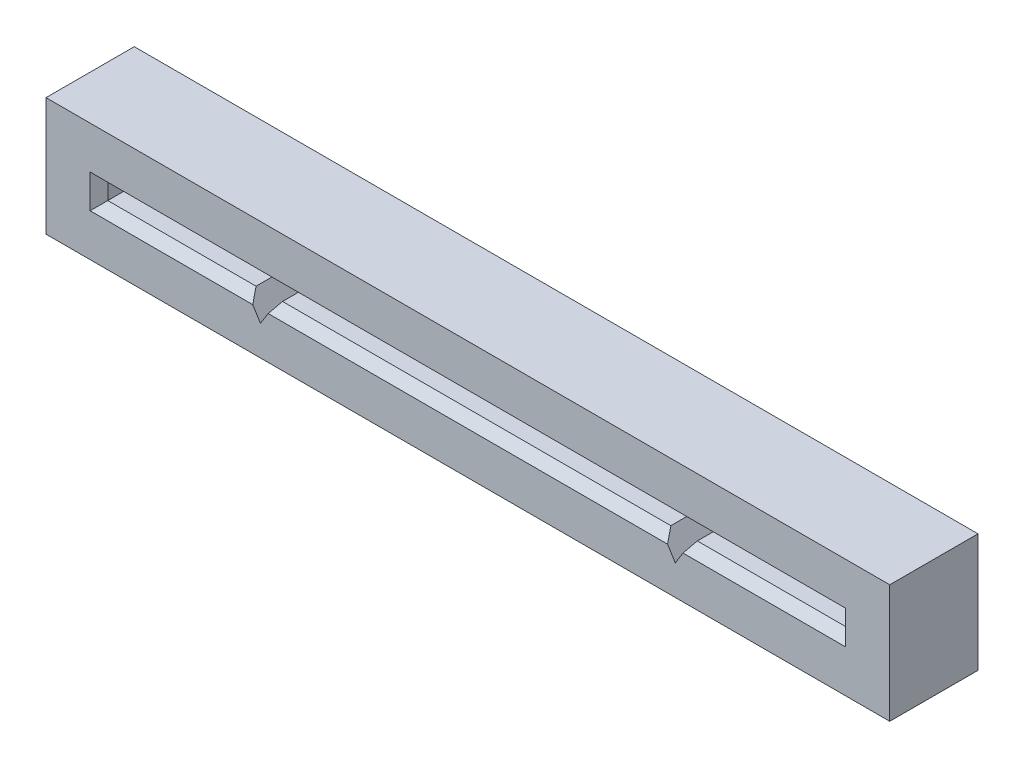
ISO-10303-21;
HEADER;
FILE_DESCRIPTION(('STEP AP214'),'2;1');
FILE_NAME('part.step','',(''),(''),'','','');
FILE_SCHEMA(('AUTOMOTIVE_DESIGN { 1 0 10303 214 1 1 1 1 }'));
ENDSEC;
DATA;
#1=APPLICATION_CONTEXT('core data for automotive mechanical design processes');
#2=APPLICATION_PROTOCOL_DEFINITION('international standard','automotive_design',2000,#1);
#3=PRODUCT_CONTEXT('',#1,'mechanical');
#4=PRODUCT('Part','Part','',(#3));
#5=PRODUCT_RELATED_PRODUCT_CATEGORY('part','',(#4));
#6=PRODUCT_DEFINITION_FORMATION('','',#4);
#7=PRODUCT_DEFINITION_CONTEXT('part definition',#1,'design');
#8=PRODUCT_DEFINITION('design','',#6,#7);
#9=PRODUCT_DEFINITION_SHAPE('','',#8);
#10=(LENGTH_UNIT() NAMED_UNIT(*) SI_UNIT(.MILLI.,.METRE.));
#11=(NAMED_UNIT(*) PLANE_ANGLE_UNIT() SI_UNIT($,.RADIAN.));
#12=(NAMED_UNIT(*) SI_UNIT($,.STERADIAN.) SOLID_ANGLE_UNIT());
#13=UNCERTAINTY_MEASURE_WITH_UNIT(LENGTH_MEASURE(1.E-05),#10,'distance_accuracy_value','');
#14=(GEOMETRIC_REPRESENTATION_CONTEXT(3) GLOBAL_UNCERTAINTY_ASSIGNED_CONTEXT((#13)) GLOBAL_UNIT_ASSIGNED_CONTEXT((#10,
#11,#12)) REPRESENTATION_CONTEXT('',''));
#15=CARTESIAN_POINT('',(0.,0.,0.));
#16=DIRECTION('',(0.,0.,1.));
#17=DIRECTION('',(1.,0.,0.));
#18=AXIS2_PLACEMENT_3D('',#15,#16,#17);
#19=CARTESIAN_POINT('',(-23.9,3.34999999999999,5.));
#20=DIRECTION('',(1.,0.,0.));
#21=DIRECTION('',(0.,0.,-1.));
#22=AXIS2_PLACEMENT_3D('',#19,#20,#21);
#23=PLANE('',#22);
#24=DIRECTION('',(0.,-1.,0.));
#25=VECTOR('',#24,1.);
#26=CARTESIAN_POINT('',(-23.9,3.34999999999999,0.));
#27=LINE('',#26,#25);
#28=CARTESIAN_POINT('',(-23.9,3.34999999999999,0.));
#29=VERTEX_POINT('',#28);
#30=CARTESIAN_POINT('',(-23.9,-3.35000000000001,0.));
#31=VERTEX_POINT('',#30);
#32=EDGE_CURVE('E196',#29,#31,#27,.T.);
#33=ORIENTED_EDGE('',*,*,#32,.T.);
#34=DIRECTION('',(0.,0.,-1.));
#35=VECTOR('',#34,1.);
#36=CARTESIAN_POINT('',(-23.9,-3.35000000000001,5.));
#37=LINE('',#36,#35);
#38=CARTESIAN_POINT('',(-23.9,-3.35000000000001,5.));
#39=VERTEX_POINT('',#38);
#40=EDGE_CURVE('E239',#39,#31,#37,.T.);
#41=ORIENTED_EDGE('',*,*,#40,.F.);
#42=DIRECTION('',(0.,-1.,0.));
#43=VECTOR('',#42,1.);
#44=CARTESIAN_POINT('',(-23.9,3.34999999999999,5.));
#45=LINE('',#44,#43);
#46=CARTESIAN_POINT('',(-23.9,3.34999999999999,5.));
#47=VERTEX_POINT('',#46);
#48=EDGE_CURVE('E213',#47,#39,#45,.T.);
#49=ORIENTED_EDGE('',*,*,#48,.F.);
#50=DIRECTION('',(0.,0.,-1.));
#51=VECTOR('',#50,1.);
#52=CARTESIAN_POINT('',(-23.9,3.34999999999999,5.));
#53=LINE('',#52,#51);
#54=EDGE_CURVE('E223',#47,#29,#53,.T.);
#55=ORIENTED_EDGE('',*,*,#54,.T.);
#56=EDGE_LOOP('',(#33,#41,#49,#55));
#57=FACE_BOUND('',#56,.T.);
#58=ADVANCED_FACE('F35',(#57),#23,.F.);
#59=CARTESIAN_POINT('',(23.9,-3.35000000000001,5.));
#60=DIRECTION('',(0.,1.,0.));
#61=DIRECTION('',(0.,0.,1.));
#62=AXIS2_PLACEMENT_3D('',#59,#60,#61);
#63=PLANE('',#62);
#64=DIRECTION('',(1.,0.,0.));
#65=VECTOR('',#64,1.);
#66=CARTESIAN_POINT('',(23.9,-3.35000000000001,0.));
#67=LINE('',#66,#65);
#68=CARTESIAN_POINT('',(23.9,-3.35000000000001,0.));
#69=VERTEX_POINT('',#68);
#70=EDGE_CURVE('E226',#31,#69,#67,.T.);
#71=ORIENTED_EDGE('',*,*,#70,.T.);
#72=DIRECTION('',(0.,0.,-1.));
#73=VECTOR('',#72,1.);
#74=CARTESIAN_POINT('',(23.9,-3.35000000000001,5.));
#75=LINE('',#74,#73);
#76=CARTESIAN_POINT('',(23.9,-3.35000000000001,5.));
#77=VERTEX_POINT('',#76);
#78=EDGE_CURVE('E236',#77,#69,#75,.T.);
#79=ORIENTED_EDGE('',*,*,#78,.F.);
#80=DIRECTION('',(1.,0.,0.));
#81=VECTOR('',#80,1.);
#82=CARTESIAN_POINT('',(23.9,-3.35000000000001,5.));
#83=LINE('',#82,#81);
#84=EDGE_CURVE('E216',#39,#77,#83,.T.);
#85=ORIENTED_EDGE('',*,*,#84,.F.);
#86=ORIENTED_EDGE('',*,*,#40,.T.);
#87=EDGE_LOOP('',(#71,#79,#85,#86));
#88=FACE_BOUND('',#87,.T.);
#89=ADVANCED_FACE('F363',(#88),#63,.F.);
#90=CARTESIAN_POINT('',(23.9,3.34999999999999,5.));
#91=DIRECTION('',(-1.,0.,0.));
#92=DIRECTION('',(0.,0.,1.));
#93=AXIS2_PLACEMENT_3D('',#90,#91,#92);
#94=PLANE('',#93);
#95=DIRECTION('',(0.,1.,0.));
#96=VECTOR('',#95,1.);
#97=CARTESIAN_POINT('',(23.9,3.34999999999999,0.));
#98=LINE('',#97,#96);
#99=CARTESIAN_POINT('',(23.9,3.34999999999999,0.));
#100=VERTEX_POINT('',#99);
#101=EDGE_CURVE('E228',#69,#100,#98,.T.);
#102=ORIENTED_EDGE('',*,*,#101,.T.);
#103=DIRECTION('',(0.,0.,-1.));
#104=VECTOR('',#103,1.);
#105=CARTESIAN_POINT('',(23.9,3.34999999999999,5.));
#106=LINE('',#105,#104);
#107=CARTESIAN_POINT('',(23.9,3.34999999999999,5.));
#108=VERTEX_POINT('',#107);
#109=EDGE_CURVE('E233',#108,#100,#106,.T.);
#110=ORIENTED_EDGE('',*,*,#109,.F.);
#111=DIRECTION('',(0.,1.,0.));
#112=VECTOR('',#111,1.);
#113=CARTESIAN_POINT('',(23.9,3.34999999999999,5.));
#114=LINE('',#113,#112);
#115=EDGE_CURVE('E219',#77,#108,#114,.T.);
#116=ORIENTED_EDGE('',*,*,#115,.F.);
#117=ORIENTED_EDGE('',*,*,#78,.T.);
#118=EDGE_LOOP('',(#102,#110,#116,#117));
#119=FACE_BOUND('',#118,.T.);
#120=ADVANCED_FACE('F369',(#119),#94,.F.);
#121=CARTESIAN_POINT('',(23.9,3.34999999999999,5.));
#122=DIRECTION('',(0.,-1.,0.));
#123=DIRECTION('',(0.,0.,-1.));
#124=AXIS2_PLACEMENT_3D('',#121,#122,#123);
#125=PLANE('',#124);
#126=DIRECTION('',(-1.,0.,0.));
#127=VECTOR('',#126,1.);
#128=CARTESIAN_POINT('',(23.9,3.34999999999999,0.));
#129=LINE('',#128,#127);
#130=EDGE_CURVE('E217',#100,#29,#129,.T.);
#131=ORIENTED_EDGE('',*,*,#130,.T.);
#132=ORIENTED_EDGE('',*,*,#54,.F.);
#133=DIRECTION('',(-1.,0.,0.));
#134=VECTOR('',#133,1.);
#135=CARTESIAN_POINT('',(23.9,3.34999999999999,5.));
#136=LINE('',#135,#134);
#137=EDGE_CURVE('E221',#108,#47,#136,.T.);
#138=ORIENTED_EDGE('',*,*,#137,.F.);
#139=ORIENTED_EDGE('',*,*,#109,.T.);
#140=EDGE_LOOP('',(#131,#132,#138,#139));
#141=FACE_BOUND('',#140,.T.);
#142=ADVANCED_FACE('F375',(#141),#125,.F.);
#143=CARTESIAN_POINT('',(0.,0.,5.));
#144=DIRECTION('',(0.,0.,-1.));
#145=DIRECTION('',(-1.,0.,0.));
#146=AXIS2_PLACEMENT_3D('',#143,#144,#145);
#147=PLANE('',#146);
#148=DIRECTION('',(0.,-1.,0.));
#149=VECTOR('',#148,1.);
#150=CARTESIAN_POINT('',(21.4,0.,5.));
#151=LINE('',#150,#149);
#152=CARTESIAN_POINT('',(21.4,0.949999999999993,5.));
#153=VERTEX_POINT('',#152);
#154=CARTESIAN_POINT('',(21.4,-0.950000000000006,5.));
#155=VERTEX_POINT('',#154);
#156=EDGE_CURVE('E272',#153,#155,#151,.T.);
#157=ORIENTED_EDGE('',*,*,#156,.T.);
#158=DIRECTION('',(-1.,0.,0.));
#159=VECTOR('',#158,1.);
#160=CARTESIAN_POINT('',(0.,-0.950000000000006,5.));
#161=LINE('',#160,#159);
#162=CARTESIAN_POINT('',(12.1875,-0.950000000000007,5.));
#163=VERTEX_POINT('',#162);
#164=EDGE_CURVE('E274',#155,#163,#161,.T.);
#165=ORIENTED_EDGE('',*,*,#164,.T.);
#166=DIRECTION('',(0.529998940003177,0.84799830400509,0.));
#167=VECTOR('',#166,1.);
#168=CARTESIAN_POINT('',(12.5,-0.450000000000006,5.));
#169=LINE('',#168,#167);
#170=CARTESIAN_POINT('',(11.75,-1.65000000000001,5.));
#171=VERTEX_POINT('',#170);
#172=EDGE_CURVE('E174',#171,#163,#169,.T.);
#173=ORIENTED_EDGE('',*,*,#172,.F.);
#174=DIRECTION('',(0.529998940003178,-0.847998304005089,0.));
#175=VECTOR('',#174,1.);
#176=CARTESIAN_POINT('',(11.75,-1.65000000000001,5.));
#177=LINE('',#176,#175);
#178=CARTESIAN_POINT('',(11.3125,-0.950000000000006,5.));
#179=VERTEX_POINT('',#178);
#180=EDGE_CURVE('E301',#179,#171,#177,.T.);
#181=ORIENTED_EDGE('',*,*,#180,.F.);
#182=DIRECTION('',(-1.,0.,0.));
#183=VECTOR('',#182,1.);
#184=CARTESIAN_POINT('',(0.,-0.950000000000006,5.));
#185=LINE('',#184,#183);
#186=CARTESIAN_POINT('',(-11.3125,-0.950000000000006,5.));
#187=VERTEX_POINT('',#186);
#188=EDGE_CURVE('E185',#179,#187,#185,.T.);
#189=ORIENTED_EDGE('',*,*,#188,.T.);
#190=DIRECTION('',(0.529998940003178,0.847998304005089,0.));
#191=VECTOR('',#190,1.);
#192=CARTESIAN_POINT('',(-11.,-0.450000000000006,5.));
#193=LINE('',#192,#191);
#194=CARTESIAN_POINT('',(-11.75,-1.65000000000001,5.));
#195=VERTEX_POINT('',#194);
#196=EDGE_CURVE('E173',#195,#187,#193,.T.);
#197=ORIENTED_EDGE('',*,*,#196,.F.);
#198=DIRECTION('',(0.529998940003178,-0.847998304005089,0.));
#199=VECTOR('',#198,1.);
#200=CARTESIAN_POINT('',(-11.75,-1.65000000000001,5.));
#201=LINE('',#200,#199);
#202=CARTESIAN_POINT('',(-12.1875,-0.950000000000006,5.));
#203=VERTEX_POINT('',#202);
#204=EDGE_CURVE('E162',#203,#195,#201,.T.);
#205=ORIENTED_EDGE('',*,*,#204,.F.);
#206=DIRECTION('',(-1.,0.,0.));
#207=VECTOR('',#206,1.);
#208=CARTESIAN_POINT('',(0.,-0.950000000000006,5.));
#209=LINE('',#208,#207);
#210=CARTESIAN_POINT('',(-21.4,-0.950000000000006,5.));
#211=VERTEX_POINT('',#210);
#212=EDGE_CURVE('E266',#203,#211,#209,.T.);
#213=ORIENTED_EDGE('',*,*,#212,.T.);
#214=DIRECTION('',(0.,1.,0.));
#215=VECTOR('',#214,1.);
#216=CARTESIAN_POINT('',(-21.4,0.,5.));
#217=LINE('',#216,#215);
#218=CARTESIAN_POINT('',(-21.4,0.949999999999993,5.));
#219=VERTEX_POINT('',#218);
#220=EDGE_CURVE('E268',#211,#219,#217,.T.);
#221=ORIENTED_EDGE('',*,*,#220,.T.);
#222=DIRECTION('',(1.,0.,0.));
#223=VECTOR('',#222,1.);
#224=CARTESIAN_POINT('',(0.,0.949999999999993,5.));
#225=LINE('',#224,#223);
#226=EDGE_CURVE('E270',#219,#153,#225,.T.);
#227=ORIENTED_EDGE('',*,*,#226,.T.);
#228=EDGE_LOOP('',(#157,#165,#173,#181,#189,#197,#205,#213,#221,#227));
#229=FACE_BOUND('',#228,.T.);
#230=ORIENTED_EDGE('',*,*,#48,.T.);
#231=ORIENTED_EDGE('',*,*,#84,.T.);
#232=ORIENTED_EDGE('',*,*,#115,.T.);
#233=ORIENTED_EDGE('',*,*,#137,.T.);
#234=EDGE_LOOP('',(#230,#231,#232,#233));
#235=FACE_BOUND('',#234,.T.);
#236=ADVANCED_FACE('F182',(#229,#235),#147,.F.);
#237=CARTESIAN_POINT('',(0.,0.,0.));
#238=DIRECTION('',(0.,0.,-1.));
#239=DIRECTION('',(-1.,0.,0.));
#240=AXIS2_PLACEMENT_3D('',#237,#238,#239);
#241=PLANE('',#240);
#242=DIRECTION('',(-0.529998940003178,0.847998304005089,0.));
#243=VECTOR('',#242,1.);
#244=CARTESIAN_POINT('',(7.70786516853935,4.81741573033707,0.));
#245=LINE('',#244,#243);
#246=CARTESIAN_POINT('',(11.75,-1.65000000000001,0.));
#247=VERTEX_POINT('',#246);
#248=CARTESIAN_POINT('',(11.,-0.450000000000006,0.));
#249=VERTEX_POINT('',#248);
#250=EDGE_CURVE('E260',#247,#249,#245,.T.);
#251=ORIENTED_EDGE('',*,*,#250,.F.);
#252=DIRECTION('',(-0.529998940003177,-0.84799830400509,0.));
#253=VECTOR('',#252,1.);
#254=CARTESIAN_POINT('',(9.1910112359551,-5.7443820224719,0.));
#255=LINE('',#254,#253);
#256=CARTESIAN_POINT('',(12.5,-0.450000000000006,0.));
#257=VERTEX_POINT('',#256);
#258=EDGE_CURVE('E242',#257,#247,#255,.T.);
#259=ORIENTED_EDGE('',*,*,#258,.F.);
#260=DIRECTION('',(-1.,0.,0.));
#261=VECTOR('',#260,1.);
#262=CARTESIAN_POINT('',(0.,-0.450000000000006,0.));
#263=LINE('',#262,#261);
#264=CARTESIAN_POINT('',(20.9,-0.450000000000006,0.));
#265=VERTEX_POINT('',#264);
#266=EDGE_CURVE('E244',#265,#257,#263,.T.);
#267=ORIENTED_EDGE('',*,*,#266,.F.);
#268=DIRECTION('',(0.,-1.,0.));
#269=VECTOR('',#268,1.);
#270=CARTESIAN_POINT('',(20.9,0.,0.));
#271=LINE('',#270,#269);
#272=CARTESIAN_POINT('',(20.9,0.449999999999992,0.));
#273=VERTEX_POINT('',#272);
#274=EDGE_CURVE('E247',#273,#265,#271,.T.);
#275=ORIENTED_EDGE('',*,*,#274,.F.);
#276=DIRECTION('',(1.,0.,0.));
#277=VECTOR('',#276,1.);
#278=CARTESIAN_POINT('',(0.,0.449999999999992,0.));
#279=LINE('',#278,#277);
#280=CARTESIAN_POINT('',(-20.9,0.449999999999992,0.));
#281=VERTEX_POINT('',#280);
#282=EDGE_CURVE('E249',#281,#273,#279,.T.);
#283=ORIENTED_EDGE('',*,*,#282,.F.);
#284=DIRECTION('',(0.,1.,0.));
#285=VECTOR('',#284,1.);
#286=CARTESIAN_POINT('',(-20.9,0.,0.));
#287=LINE('',#286,#285);
#288=CARTESIAN_POINT('',(-20.9,-0.450000000000006,0.));
#289=VERTEX_POINT('',#288);
#290=EDGE_CURVE('E251',#289,#281,#287,.T.);
#291=ORIENTED_EDGE('',*,*,#290,.F.);
#292=DIRECTION('',(-1.,0.,0.));
#293=VECTOR('',#292,1.);
#294=CARTESIAN_POINT('',(0.,-0.450000000000006,0.));
#295=LINE('',#294,#293);
#296=CARTESIAN_POINT('',(-12.5,-0.450000000000006,0.));
#297=VERTEX_POINT('',#296);
#298=EDGE_CURVE('E253',#297,#289,#295,.T.);
#299=ORIENTED_EDGE('',*,*,#298,.F.);
#300=DIRECTION('',(-0.529998940003178,0.847998304005089,0.));
#301=VECTOR('',#300,1.);
#302=CARTESIAN_POINT('',(-9.19101123595508,-5.7443820224719,0.));
#303=LINE('',#302,#301);
#304=CARTESIAN_POINT('',(-11.75,-1.65000000000001,0.));
#305=VERTEX_POINT('',#304);
#306=EDGE_CURVE('E255',#305,#297,#303,.T.);
#307=ORIENTED_EDGE('',*,*,#306,.F.);
#308=DIRECTION('',(-0.529998940003178,-0.847998304005089,0.));
#309=VECTOR('',#308,1.);
#310=CARTESIAN_POINT('',(-7.70786516853934,4.81741573033706,0.));
#311=LINE('',#310,#309);
#312=CARTESIAN_POINT('',(-11.,-0.450000000000006,0.));
#313=VERTEX_POINT('',#312);
#314=EDGE_CURVE('E178',#313,#305,#311,.T.);
#315=ORIENTED_EDGE('',*,*,#314,.F.);
#316=DIRECTION('',(-1.,0.,0.));
#317=VECTOR('',#316,1.);
#318=CARTESIAN_POINT('',(0.,-0.450000000000006,0.));
#319=LINE('',#318,#317);
#320=EDGE_CURVE('E258',#249,#313,#319,.T.);
#321=ORIENTED_EDGE('',*,*,#320,.F.);
#322=EDGE_LOOP('',(#251,#259,#267,#275,#283,#291,#299,#307,#315,#321));
#323=FACE_BOUND('',#322,.T.);
#324=ORIENTED_EDGE('',*,*,#32,.F.);
#325=ORIENTED_EDGE('',*,*,#130,.F.);
#326=ORIENTED_EDGE('',*,*,#101,.F.);
#327=ORIENTED_EDGE('',*,*,#70,.F.);
#328=EDGE_LOOP('',(#324,#325,#326,#327));
#329=FACE_BOUND('',#328,.T.);
#330=ADVANCED_FACE('F331',(#323,#329),#241,.T.);
#331=CARTESIAN_POINT('',(11.75,-1.65000000000001,-2.5));
#332=DIRECTION('',(-0.847998304005089,-0.529998940003178,0.));
#333=DIRECTION('',(0.529998940003178,-0.847998304005089,0.));
#334=AXIS2_PLACEMENT_3D('',#331,#332,#333);
#335=PLANE('',#334);
#336=DIRECTION('',(0.,0.,1.));
#337=VECTOR('',#336,1.);
#338=CARTESIAN_POINT('',(11.,-0.450000000000006,-2.5));
#339=LINE('',#338,#337);
#340=CARTESIAN_POINT('',(11.,-0.450000000000006,4.50000000000001));
#341=VERTEX_POINT('',#340);
#342=EDGE_CURVE('E193',#249,#341,#339,.T.);
#343=ORIENTED_EDGE('',*,*,#342,.T.);
#344=DIRECTION('',(-0.404226041727222,0.646761666763559,-0.64676166676355));
#345=VECTOR('',#344,1.);
#346=CARTESIAN_POINT('',(11.,-0.450000000000006,4.50000000000001));
#347=LINE('',#346,#345);
#348=EDGE_CURVE('E44',#341,#179,#347,.F.);
#349=ORIENTED_EDGE('',*,*,#348,.T.);
#350=ORIENTED_EDGE('',*,*,#180,.T.);
#351=DIRECTION('',(0.,0.,1.));
#352=VECTOR('',#351,1.);
#353=CARTESIAN_POINT('',(11.75,-1.65000000000001,-2.5));
#354=LINE('',#353,#352);
#355=EDGE_CURVE('E186',#247,#171,#354,.T.);
#356=ORIENTED_EDGE('',*,*,#355,.F.);
#357=ORIENTED_EDGE('',*,*,#250,.T.);
#358=EDGE_LOOP('',(#343,#349,#350,#356,#357));
#359=FACE_BOUND('',#358,.T.);
#360=ADVANCED_FACE('F336',(#359),#335,.F.);
#361=CARTESIAN_POINT('',(11.,-0.450000000000006,-2.5));
#362=DIRECTION('',(0.,-1.,0.));
#363=DIRECTION('',(0.,0.,-1.));
#364=AXIS2_PLACEMENT_3D('',#361,#362,#363);
#365=PLANE('',#364);
#366=DIRECTION('',(0.,0.,1.));
#367=VECTOR('',#366,1.);
#368=CARTESIAN_POINT('',(-11.,-0.450000000000006,-2.5));
#369=LINE('',#368,#367);
#370=CARTESIAN_POINT('',(-11.,-0.450000000000006,4.50000000000001));
#371=VERTEX_POINT('',#370);
#372=EDGE_CURVE('E179',#313,#371,#369,.T.);
#373=ORIENTED_EDGE('',*,*,#372,.T.);
#374=DIRECTION('',(1.,0.,0.));
#375=VECTOR('',#374,1.);
#376=CARTESIAN_POINT('',(11.,-0.450000000000006,4.50000000000001));
#377=LINE('',#376,#375);
#378=EDGE_CURVE('E287',#371,#341,#377,.T.);
#379=ORIENTED_EDGE('',*,*,#378,.T.);
#380=ORIENTED_EDGE('',*,*,#342,.F.);
#381=ORIENTED_EDGE('',*,*,#320,.T.);
#382=EDGE_LOOP('',(#373,#379,#380,#381));
#383=FACE_BOUND('',#382,.T.);
#384=ADVANCED_FACE('F339',(#383),#365,.F.);
#385=CARTESIAN_POINT('',(-11.,-0.450000000000006,-2.5));
#386=DIRECTION('',(0.847998304005089,-0.529998940003178,0.));
#387=DIRECTION('',(0.529998940003178,0.847998304005089,0.));
#388=AXIS2_PLACEMENT_3D('',#385,#386,#387);
#389=PLANE('',#388);
#390=ORIENTED_EDGE('',*,*,#196,.T.);
#391=DIRECTION('',(-0.404226041727222,-0.646761666763559,0.64676166676355));
#392=VECTOR('',#391,1.);
#393=CARTESIAN_POINT('',(-7.40522875816992,5.30163398692815,-1.25163398692807));
#394=LINE('',#393,#392);
#395=EDGE_CURVE('E11',#187,#371,#394,.F.);
#396=ORIENTED_EDGE('',*,*,#395,.T.);
#397=ORIENTED_EDGE('',*,*,#372,.F.);
#398=ORIENTED_EDGE('',*,*,#314,.T.);
#399=DIRECTION('',(0.,0.,1.));
#400=VECTOR('',#399,1.);
#401=CARTESIAN_POINT('',(-11.75,-1.65000000000001,-2.5));
#402=LINE('',#401,#400);
#403=EDGE_CURVE('E166',#305,#195,#402,.T.);
#404=ORIENTED_EDGE('',*,*,#403,.T.);
#405=EDGE_LOOP('',(#390,#396,#397,#398,#404));
#406=FACE_BOUND('',#405,.T.);
#407=ADVANCED_FACE('F176',(#406),#389,.F.);
#408=CARTESIAN_POINT('',(-11.75,-1.65000000000001,-2.5));
#409=DIRECTION('',(-0.847998304005089,-0.529998940003178,0.));
#410=DIRECTION('',(0.529998940003178,-0.847998304005089,0.));
#411=AXIS2_PLACEMENT_3D('',#408,#409,#410);
#412=PLANE('',#411);
#413=DIRECTION('',(0.,0.,1.));
#414=VECTOR('',#413,1.);
#415=CARTESIAN_POINT('',(-12.5,-0.450000000000006,-2.5));
#416=LINE('',#415,#414);
#417=CARTESIAN_POINT('',(-12.5,-0.450000000000006,4.50000000000001));
#418=VERTEX_POINT('',#417);
#419=EDGE_CURVE('E180',#297,#418,#416,.T.);
#420=ORIENTED_EDGE('',*,*,#419,.T.);
#421=DIRECTION('',(-0.404226041727222,0.646761666763559,-0.64676166676355));
#422=VECTOR('',#421,1.);
#423=CARTESIAN_POINT('',(-12.5,-0.450000000000006,4.50000000000001));
#424=LINE('',#423,#422);
#425=EDGE_CURVE('E169',#418,#203,#424,.F.);
#426=ORIENTED_EDGE('',*,*,#425,.T.);
#427=ORIENTED_EDGE('',*,*,#204,.T.);
#428=ORIENTED_EDGE('',*,*,#403,.F.);
#429=ORIENTED_EDGE('',*,*,#306,.T.);
#430=EDGE_LOOP('',(#420,#426,#427,#428,#429));
#431=FACE_BOUND('',#430,.T.);
#432=ADVANCED_FACE('F165',(#431),#412,.F.);
#433=CARTESIAN_POINT('',(-12.5,-0.450000000000006,-2.5));
#434=DIRECTION('',(0.,-1.,0.));
#435=DIRECTION('',(0.,0.,-1.));
#436=AXIS2_PLACEMENT_3D('',#433,#434,#435);
#437=PLANE('',#436);
#438=DIRECTION('',(0.,0.,1.));
#439=VECTOR('',#438,1.);
#440=CARTESIAN_POINT('',(-20.9,-0.450000000000006,-2.5));
#441=LINE('',#440,#439);
#442=CARTESIAN_POINT('',(-20.9,-0.450000000000006,4.50000000000001));
#443=VERTEX_POINT('',#442);
#444=EDGE_CURVE('E199',#289,#443,#441,.T.);
#445=ORIENTED_EDGE('',*,*,#444,.T.);
#446=DIRECTION('',(1.,0.,0.));
#447=VECTOR('',#446,1.);
#448=CARTESIAN_POINT('',(-12.5,-0.450000000000006,4.50000000000001));
#449=LINE('',#448,#447);
#450=EDGE_CURVE('E284',#443,#418,#449,.T.);
#451=ORIENTED_EDGE('',*,*,#450,.T.);
#452=ORIENTED_EDGE('',*,*,#419,.F.);
#453=ORIENTED_EDGE('',*,*,#298,.T.);
#454=EDGE_LOOP('',(#445,#451,#452,#453));
#455=FACE_BOUND('',#454,.T.);
#456=ADVANCED_FACE('F343',(#455),#437,.F.);
#457=CARTESIAN_POINT('',(-20.9,-0.450000000000006,-2.5));
#458=DIRECTION('',(-1.,0.,0.));
#459=DIRECTION('',(0.,0.,1.));
#460=AXIS2_PLACEMENT_3D('',#457,#458,#459);
#461=PLANE('',#460);
#462=DIRECTION('',(0.,0.,1.));
#463=VECTOR('',#462,1.);
#464=CARTESIAN_POINT('',(-20.9,0.449999999999992,-2.5));
#465=LINE('',#464,#463);
#466=CARTESIAN_POINT('',(-20.9,0.449999999999992,4.50000000000001));
#467=VERTEX_POINT('',#466);
#468=EDGE_CURVE('E202',#281,#467,#465,.T.);
#469=ORIENTED_EDGE('',*,*,#468,.T.);
#470=DIRECTION('',(0.,-1.,0.));
#471=VECTOR('',#470,1.);
#472=CARTESIAN_POINT('',(-20.9,-0.450000000000006,4.50000000000001));
#473=LINE('',#472,#471);
#474=EDGE_CURVE('E282',#467,#443,#473,.T.);
#475=ORIENTED_EDGE('',*,*,#474,.T.);
#476=ORIENTED_EDGE('',*,*,#444,.F.);
#477=ORIENTED_EDGE('',*,*,#290,.T.);
#478=EDGE_LOOP('',(#469,#475,#476,#477));
#479=FACE_BOUND('',#478,.T.);
#480=ADVANCED_FACE('F395',(#479),#461,.F.);
#481=CARTESIAN_POINT('',(20.9,0.449999999999992,-2.5));
#482=DIRECTION('',(0.,1.,0.));
#483=DIRECTION('',(0.,0.,1.));
#484=AXIS2_PLACEMENT_3D('',#481,#482,#483);
#485=PLANE('',#484);
#486=DIRECTION('',(0.,0.,1.));
#487=VECTOR('',#486,1.);
#488=CARTESIAN_POINT('',(20.9,0.449999999999992,-2.5));
#489=LINE('',#488,#487);
#490=CARTESIAN_POINT('',(20.9,0.449999999999992,4.50000000000001));
#491=VERTEX_POINT('',#490);
#492=EDGE_CURVE('E205',#273,#491,#489,.T.);
#493=ORIENTED_EDGE('',*,*,#492,.T.);
#494=DIRECTION('',(-1.,0.,0.));
#495=VECTOR('',#494,1.);
#496=CARTESIAN_POINT('',(20.9,0.449999999999992,4.50000000000001));
#497=LINE('',#496,#495);
#498=EDGE_CURVE('E280',#491,#467,#497,.T.);
#499=ORIENTED_EDGE('',*,*,#498,.T.);
#500=ORIENTED_EDGE('',*,*,#468,.F.);
#501=ORIENTED_EDGE('',*,*,#282,.T.);
#502=EDGE_LOOP('',(#493,#499,#500,#501));
#503=FACE_BOUND('',#502,.T.);
#504=ADVANCED_FACE('F392',(#503),#485,.F.);
#505=CARTESIAN_POINT('',(20.9,-0.450000000000006,-2.5));
#506=DIRECTION('',(1.,0.,0.));
#507=DIRECTION('',(0.,0.,-1.));
#508=AXIS2_PLACEMENT_3D('',#505,#506,#507);
#509=PLANE('',#508);
#510=DIRECTION('',(0.,0.,1.));
#511=VECTOR('',#510,1.);
#512=CARTESIAN_POINT('',(20.9,-0.450000000000006,-2.5));
#513=LINE('',#512,#511);
#514=CARTESIAN_POINT('',(20.9,-0.450000000000006,4.50000000000001));
#515=VERTEX_POINT('',#514);
#516=EDGE_CURVE('E208',#265,#515,#513,.T.);
#517=ORIENTED_EDGE('',*,*,#516,.T.);
#518=DIRECTION('',(0.,1.,0.));
#519=VECTOR('',#518,1.);
#520=CARTESIAN_POINT('',(20.9,-0.450000000000006,4.50000000000001));
#521=LINE('',#520,#519);
#522=EDGE_CURVE('E278',#515,#491,#521,.T.);
#523=ORIENTED_EDGE('',*,*,#522,.T.);
#524=ORIENTED_EDGE('',*,*,#492,.F.);
#525=ORIENTED_EDGE('',*,*,#274,.T.);
#526=EDGE_LOOP('',(#517,#523,#524,#525));
#527=FACE_BOUND('',#526,.T.);
#528=ADVANCED_FACE('F325',(#527),#509,.F.);
#529=CARTESIAN_POINT('',(20.9,-0.450000000000006,-2.5));
#530=DIRECTION('',(0.,-1.,0.));
#531=DIRECTION('',(0.,0.,-1.));
#532=AXIS2_PLACEMENT_3D('',#529,#530,#531);
#533=PLANE('',#532);
#534=DIRECTION('',(0.,0.,1.));
#535=VECTOR('',#534,1.);
#536=CARTESIAN_POINT('',(12.5,-0.450000000000006,-2.5));
#537=LINE('',#536,#535);
#538=CARTESIAN_POINT('',(12.5,-0.450000000000006,4.50000000000001));
#539=VERTEX_POINT('',#538);
#540=EDGE_CURVE('E189',#257,#539,#537,.T.);
#541=ORIENTED_EDGE('',*,*,#540,.T.);
#542=DIRECTION('',(1.,0.,0.));
#543=VECTOR('',#542,1.);
#544=CARTESIAN_POINT('',(20.9,-0.450000000000006,4.50000000000001));
#545=LINE('',#544,#543);
#546=EDGE_CURVE('E262',#539,#515,#545,.T.);
#547=ORIENTED_EDGE('',*,*,#546,.T.);
#548=ORIENTED_EDGE('',*,*,#516,.F.);
#549=ORIENTED_EDGE('',*,*,#266,.T.);
#550=EDGE_LOOP('',(#541,#547,#548,#549));
#551=FACE_BOUND('',#550,.T.);
#552=ADVANCED_FACE('F322',(#551),#533,.F.);
#553=CARTESIAN_POINT('',(12.5,-0.450000000000006,-2.5));
#554=DIRECTION('',(0.84799830400509,-0.529998940003177,0.));
#555=DIRECTION('',(0.529998940003177,0.84799830400509,0.));
#556=AXIS2_PLACEMENT_3D('',#553,#554,#555);
#557=PLANE('',#556);
#558=ORIENTED_EDGE('',*,*,#172,.T.);
#559=DIRECTION('',(-0.404226041727222,-0.646761666763559,0.64676166676355));
#560=VECTOR('',#559,1.);
#561=CARTESIAN_POINT('',(13.8725490196078,1.74607843137256,2.30392156862747));
#562=LINE('',#561,#560);
#563=EDGE_CURVE('E276',#163,#539,#562,.F.);
#564=ORIENTED_EDGE('',*,*,#563,.T.);
#565=ORIENTED_EDGE('',*,*,#540,.F.);
#566=ORIENTED_EDGE('',*,*,#258,.T.);
#567=ORIENTED_EDGE('',*,*,#355,.T.);
#568=EDGE_LOOP('',(#558,#564,#565,#566,#567));
#569=FACE_BOUND('',#568,.T.);
#570=ADVANCED_FACE('F313',(#569),#557,.F.);
#571=CARTESIAN_POINT('',(-12.5,-0.450000000000006,4.50000000000001));
#572=DIRECTION('',(0.,-0.707106781186543,-0.707106781186552));
#573=DIRECTION('',(1.,0.,0.));
#574=AXIS2_PLACEMENT_3D('',#571,#572,#573);
#575=PLANE('',#574);
#576=ORIENTED_EDGE('',*,*,#425,.F.);
#577=ORIENTED_EDGE('',*,*,#450,.F.);
#578=DIRECTION('',(-0.577350269189628,-0.577350269189628,0.57735026918962));
#579=VECTOR('',#578,1.);
#580=CARTESIAN_POINT('',(-20.9,-0.450000000000006,4.50000000000001));
#581=LINE('',#580,#579);
#582=EDGE_CURVE('E39',#211,#443,#581,.F.);
#583=ORIENTED_EDGE('',*,*,#582,.F.);
#584=ORIENTED_EDGE('',*,*,#212,.F.);
#585=EDGE_LOOP('',(#576,#577,#583,#584));
#586=FACE_BOUND('',#585,.T.);
#587=ADVANCED_FACE('F347',(#586),#575,.F.);
#588=CARTESIAN_POINT('',(-20.9,-0.450000000000006,4.50000000000001));
#589=DIRECTION('',(-0.707106781186543,0.,-0.707106781186552));
#590=DIRECTION('',(0.,-1.,0.));
#591=AXIS2_PLACEMENT_3D('',#588,#589,#590);
#592=PLANE('',#591);
#593=ORIENTED_EDGE('',*,*,#582,.T.);
#594=ORIENTED_EDGE('',*,*,#474,.F.);
#595=DIRECTION('',(-0.577350269189628,0.577350269189628,0.57735026918962));
#596=VECTOR('',#595,1.);
#597=CARTESIAN_POINT('',(-6.96666666666653,-13.4833333333335,-9.43333333333326));
#598=LINE('',#597,#596);
#599=EDGE_CURVE('E294',#219,#467,#598,.F.);
#600=ORIENTED_EDGE('',*,*,#599,.F.);
#601=ORIENTED_EDGE('',*,*,#220,.F.);
#602=EDGE_LOOP('',(#593,#594,#600,#601));
#603=FACE_BOUND('',#602,.T.);
#604=ADVANCED_FACE('F349',(#603),#592,.F.);
#605=CARTESIAN_POINT('',(20.9,0.449999999999992,4.50000000000001));
#606=DIRECTION('',(0.,0.707106781186543,-0.707106781186552));
#607=DIRECTION('',(-1.,0.,0.));
#608=AXIS2_PLACEMENT_3D('',#605,#606,#607);
#609=PLANE('',#608);
#610=ORIENTED_EDGE('',*,*,#599,.T.);
#611=ORIENTED_EDGE('',*,*,#498,.F.);
#612=DIRECTION('',(0.577350269189628,0.577350269189628,0.57735026918962));
#613=VECTOR('',#612,1.);
#614=CARTESIAN_POINT('',(20.6,0.14999999999999,4.20000000000001));
#615=LINE('',#614,#613);
#616=EDGE_CURVE('E292',#153,#491,#615,.F.);
#617=ORIENTED_EDGE('',*,*,#616,.F.);
#618=ORIENTED_EDGE('',*,*,#226,.F.);
#619=EDGE_LOOP('',(#610,#611,#617,#618));
#620=FACE_BOUND('',#619,.T.);
#621=ADVANCED_FACE('F350',(#620),#609,.F.);
#622=CARTESIAN_POINT('',(20.9,-0.450000000000006,4.50000000000001));
#623=DIRECTION('',(0.707106781186543,0.,-0.707106781186552));
#624=DIRECTION('',(0.,1.,0.));
#625=AXIS2_PLACEMENT_3D('',#622,#623,#624);
#626=PLANE('',#625);
#627=ORIENTED_EDGE('',*,*,#616,.T.);
#628=ORIENTED_EDGE('',*,*,#522,.F.);
#629=DIRECTION('',(0.577350269189628,-0.577350269189628,0.57735026918962));
#630=VECTOR('',#629,1.);
#631=CARTESIAN_POINT('',(20.9,-0.450000000000006,4.50000000000001));
#632=LINE('',#631,#630);
#633=EDGE_CURVE('E290',#155,#515,#632,.F.);
#634=ORIENTED_EDGE('',*,*,#633,.F.);
#635=ORIENTED_EDGE('',*,*,#156,.F.);
#636=EDGE_LOOP('',(#627,#628,#634,#635));
#637=FACE_BOUND('',#636,.T.);
#638=ADVANCED_FACE('F353',(#637),#626,.F.);
#639=CARTESIAN_POINT('',(20.9,-0.450000000000006,4.50000000000001));
#640=DIRECTION('',(0.,-0.707106781186543,-0.707106781186552));
#641=DIRECTION('',(1.,0.,0.));
#642=AXIS2_PLACEMENT_3D('',#639,#640,#641);
#643=PLANE('',#642);
#644=ORIENTED_EDGE('',*,*,#563,.F.);
#645=ORIENTED_EDGE('',*,*,#164,.F.);
#646=ORIENTED_EDGE('',*,*,#633,.T.);
#647=ORIENTED_EDGE('',*,*,#546,.F.);
#648=EDGE_LOOP('',(#644,#645,#646,#647));
#649=FACE_BOUND('',#648,.T.);
#650=ADVANCED_FACE('F317',(#649),#643,.F.);
#651=CARTESIAN_POINT('',(11.,-0.450000000000006,4.50000000000001));
#652=DIRECTION('',(0.,-0.707106781186543,-0.707106781186552));
#653=DIRECTION('',(1.,0.,0.));
#654=AXIS2_PLACEMENT_3D('',#651,#652,#653);
#655=PLANE('',#654);
#656=ORIENTED_EDGE('',*,*,#395,.F.);
#657=ORIENTED_EDGE('',*,*,#188,.F.);
#658=ORIENTED_EDGE('',*,*,#348,.F.);
#659=ORIENTED_EDGE('',*,*,#378,.F.);
#660=EDGE_LOOP('',(#656,#657,#658,#659));
#661=FACE_BOUND('',#660,.T.);
#662=ADVANCED_FACE('F37',(#661),#655,.F.);
#663=CLOSED_SHELL('',(#58,#89,#120,#142,#236,#330,#360,#384,#407,#432,#456,#480,#504,#528,#552,
#570,#587,#604,#621,#638,#650,#662));
#664=MANIFOLD_SOLID_BREP('B2',#663);
#665=ADVANCED_BREP_SHAPE_REPRESENTATION('',(#18,#664),#14);
#666=SHAPE_DEFINITION_REPRESENTATION(#9,#665);
ENDSEC;
END-ISO-10303-21;
